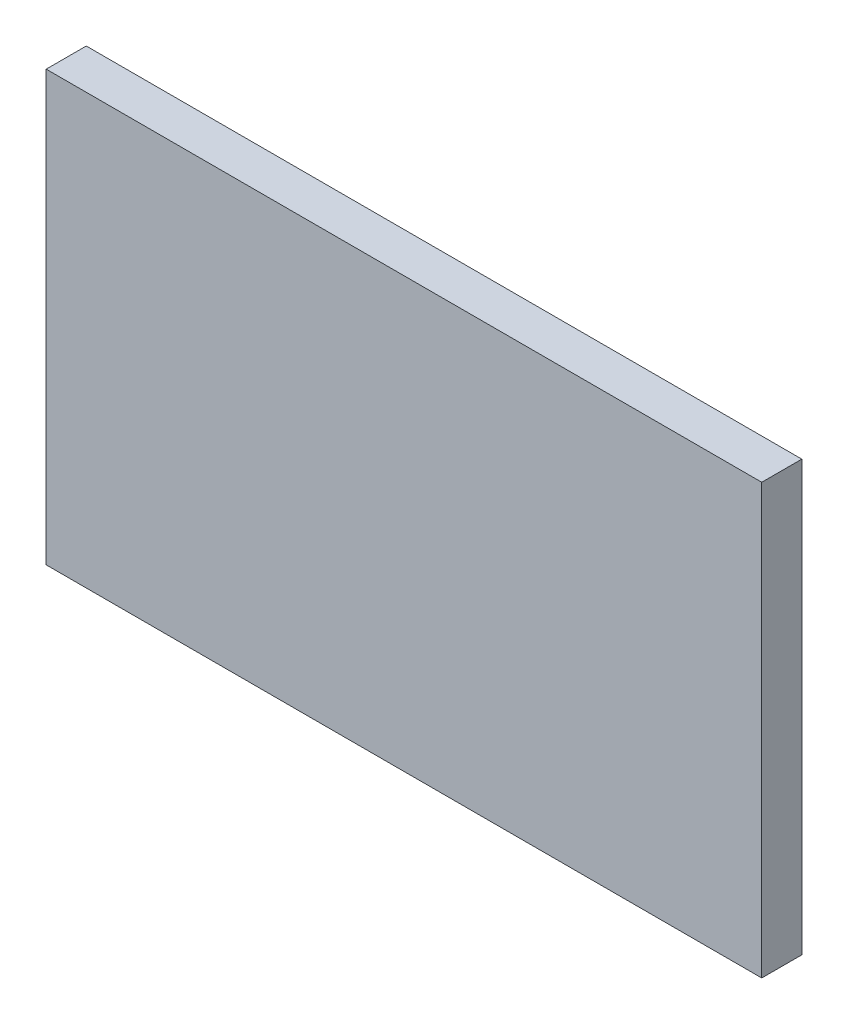
ISO-10303-21;
HEADER;
FILE_DESCRIPTION(('STEP AP214'),'2;1');
FILE_NAME('part.step','',(''),(''),'','','');
FILE_SCHEMA(('AUTOMOTIVE_DESIGN { 1 0 10303 214 1 1 1 1 }'));
ENDSEC;
DATA;
#1=APPLICATION_CONTEXT('core data for automotive mechanical design processes');
#2=APPLICATION_PROTOCOL_DEFINITION('international standard','automotive_design',2000,#1);
#3=PRODUCT_CONTEXT('',#1,'mechanical');
#4=PRODUCT('Part','Part','',(#3));
#5=PRODUCT_RELATED_PRODUCT_CATEGORY('part','',(#4));
#6=PRODUCT_DEFINITION_FORMATION('','',#4);
#7=PRODUCT_DEFINITION_CONTEXT('part definition',#1,'design');
#8=PRODUCT_DEFINITION('design','',#6,#7);
#9=PRODUCT_DEFINITION_SHAPE('','',#8);
#10=(LENGTH_UNIT() NAMED_UNIT(*) SI_UNIT(.MILLI.,.METRE.));
#11=(NAMED_UNIT(*) PLANE_ANGLE_UNIT() SI_UNIT($,.RADIAN.));
#12=(NAMED_UNIT(*) SI_UNIT($,.STERADIAN.) SOLID_ANGLE_UNIT());
#13=UNCERTAINTY_MEASURE_WITH_UNIT(LENGTH_MEASURE(1.E-05),#10,'distance_accuracy_value','');
#14=(GEOMETRIC_REPRESENTATION_CONTEXT(3) GLOBAL_UNCERTAINTY_ASSIGNED_CONTEXT((#13)) GLOBAL_UNIT_ASSIGNED_CONTEXT((#10,
#11,#12)) REPRESENTATION_CONTEXT('',''));
#15=CARTESIAN_POINT('',(0.,0.,0.));
#16=DIRECTION('',(0.,0.,1.));
#17=DIRECTION('',(1.,0.,0.));
#18=AXIS2_PLACEMENT_3D('',#15,#16,#17);
#19=CARTESIAN_POINT('',(-79.1957684576334,25.3826530612245,1.4));
#20=DIRECTION('',(1.,0.,0.));
#21=DIRECTION('',(0.,0.,-1.));
#22=AXIS2_PLACEMENT_3D('',#19,#20,#21);
#23=PLANE('',#22);
#24=DIRECTION('',(0.,-1.,0.));
#25=VECTOR('',#24,1.);
#26=CARTESIAN_POINT('',(-79.1957684576334,25.3826530612245,0.));
#27=LINE('',#26,#25);
#28=CARTESIAN_POINT('',(-79.1957684576334,25.3826530612245,0.));
#29=VERTEX_POINT('',#28);
#30=CARTESIAN_POINT('',(-79.1957684576334,10.3826530612245,0.));
#31=VERTEX_POINT('',#30);
#32=EDGE_CURVE('E96',#29,#31,#27,.T.);
#33=ORIENTED_EDGE('',*,*,#32,.T.);
#34=DIRECTION('',(0.,0.,-1.));
#35=VECTOR('',#34,1.);
#36=CARTESIAN_POINT('',(-79.1957684576334,10.3826530612245,1.4));
#37=LINE('',#36,#35);
#38=CARTESIAN_POINT('',(-79.1957684576334,10.3826530612245,1.4));
#39=VERTEX_POINT('',#38);
#40=EDGE_CURVE('E11',#39,#31,#37,.T.);
#41=ORIENTED_EDGE('',*,*,#40,.F.);
#42=DIRECTION('',(0.,-1.,0.));
#43=VECTOR('',#42,1.);
#44=CARTESIAN_POINT('',(-79.1957684576334,25.3826530612245,1.4));
#45=LINE('',#44,#43);
#46=CARTESIAN_POINT('',(-79.1957684576334,25.3826530612245,1.4));
#47=VERTEX_POINT('',#46);
#48=EDGE_CURVE('E84',#47,#39,#45,.T.);
#49=ORIENTED_EDGE('',*,*,#48,.F.);
#50=DIRECTION('',(0.,0.,-1.));
#51=VECTOR('',#50,1.);
#52=CARTESIAN_POINT('',(-79.1957684576334,25.3826530612245,1.4));
#53=LINE('',#52,#51);
#54=EDGE_CURVE('E92',#47,#29,#53,.T.);
#55=ORIENTED_EDGE('',*,*,#54,.T.);
#56=EDGE_LOOP('',(#33,#41,#49,#55));
#57=FACE_BOUND('',#56,.T.);
#58=ADVANCED_FACE('F33',(#57),#23,.F.);
#59=CARTESIAN_POINT('',(-79.1957684576334,10.3826530612245,1.4));
#60=DIRECTION('',(0.,1.,0.));
#61=DIRECTION('',(0.,0.,1.));
#62=AXIS2_PLACEMENT_3D('',#59,#60,#61);
#63=PLANE('',#62);
#64=DIRECTION('',(1.,0.,0.));
#65=VECTOR('',#64,1.);
#66=CARTESIAN_POINT('',(-79.1957684576334,10.3826530612245,0.));
#67=LINE('',#66,#65);
#68=CARTESIAN_POINT('',(-54.1957684576334,10.3826530612245,0.));
#69=VERTEX_POINT('',#68);
#70=EDGE_CURVE('E88',#31,#69,#67,.T.);
#71=ORIENTED_EDGE('',*,*,#70,.T.);
#72=DIRECTION('',(0.,0.,-1.));
#73=VECTOR('',#72,1.);
#74=CARTESIAN_POINT('',(-54.1957684576334,10.3826530612245,1.4));
#75=LINE('',#74,#73);
#76=CARTESIAN_POINT('',(-54.1957684576334,10.3826530612245,1.4));
#77=VERTEX_POINT('',#76);
#78=EDGE_CURVE('E41',#77,#69,#75,.T.);
#79=ORIENTED_EDGE('',*,*,#78,.F.);
#80=DIRECTION('',(1.,0.,0.));
#81=VECTOR('',#80,1.);
#82=CARTESIAN_POINT('',(-79.1957684576334,10.3826530612245,1.4));
#83=LINE('',#82,#81);
#84=EDGE_CURVE('E79',#39,#77,#83,.T.);
#85=ORIENTED_EDGE('',*,*,#84,.F.);
#86=ORIENTED_EDGE('',*,*,#40,.T.);
#87=EDGE_LOOP('',(#71,#79,#85,#86));
#88=FACE_BOUND('',#87,.T.);
#89=ADVANCED_FACE('F87',(#88),#63,.F.);
#90=CARTESIAN_POINT('',(-54.1957684576334,25.3826530612245,1.4));
#91=DIRECTION('',(-1.,0.,0.));
#92=DIRECTION('',(0.,-1.,0.));
#93=AXIS2_PLACEMENT_3D('',#90,#91,#92);
#94=PLANE('',#93);
#95=DIRECTION('',(0.,1.,0.));
#96=VECTOR('',#95,1.);
#97=CARTESIAN_POINT('',(-54.1957684576334,25.3826530612245,0.));
#98=LINE('',#97,#96);
#99=CARTESIAN_POINT('',(-54.1957684576334,25.3826530612245,0.));
#100=VERTEX_POINT('',#99);
#101=EDGE_CURVE('E66',#69,#100,#98,.T.);
#102=ORIENTED_EDGE('',*,*,#101,.T.);
#103=DIRECTION('',(0.,0.,-1.));
#104=VECTOR('',#103,1.);
#105=CARTESIAN_POINT('',(-54.1957684576334,25.3826530612245,1.4));
#106=LINE('',#105,#104);
#107=CARTESIAN_POINT('',(-54.1957684576334,25.3826530612245,1.4));
#108=VERTEX_POINT('',#107);
#109=EDGE_CURVE('E89',#108,#100,#106,.T.);
#110=ORIENTED_EDGE('',*,*,#109,.F.);
#111=DIRECTION('',(0.,1.,0.));
#112=VECTOR('',#111,1.);
#113=CARTESIAN_POINT('',(-54.1957684576334,25.3826530612245,1.4));
#114=LINE('',#113,#112);
#115=EDGE_CURVE('E82',#77,#108,#114,.T.);
#116=ORIENTED_EDGE('',*,*,#115,.F.);
#117=ORIENTED_EDGE('',*,*,#78,.T.);
#118=EDGE_LOOP('',(#102,#110,#116,#117));
#119=FACE_BOUND('',#118,.T.);
#120=ADVANCED_FACE('F90',(#119),#94,.F.);
#121=CARTESIAN_POINT('',(-79.1957684576334,25.3826530612245,1.4));
#122=DIRECTION('',(0.,-1.,0.));
#123=DIRECTION('',(0.,0.,-1.));
#124=AXIS2_PLACEMENT_3D('',#121,#122,#123);
#125=PLANE('',#124);
#126=DIRECTION('',(-1.,0.,0.));
#127=VECTOR('',#126,1.);
#128=CARTESIAN_POINT('',(-79.1957684576334,25.3826530612245,0.));
#129=LINE('',#128,#127);
#130=EDGE_CURVE('E72',#100,#29,#129,.T.);
#131=ORIENTED_EDGE('',*,*,#130,.T.);
#132=ORIENTED_EDGE('',*,*,#54,.F.);
#133=DIRECTION('',(-1.,0.,0.));
#134=VECTOR('',#133,1.);
#135=CARTESIAN_POINT('',(-79.1957684576334,25.3826530612245,1.4));
#136=LINE('',#135,#134);
#137=EDGE_CURVE('E49',#108,#47,#136,.T.);
#138=ORIENTED_EDGE('',*,*,#137,.F.);
#139=ORIENTED_EDGE('',*,*,#109,.T.);
#140=EDGE_LOOP('',(#131,#132,#138,#139));
#141=FACE_BOUND('',#140,.T.);
#142=ADVANCED_FACE('F103',(#141),#125,.F.);
#143=CARTESIAN_POINT('',(0.,0.,1.4));
#144=DIRECTION('',(0.,0.,1.));
#145=DIRECTION('',(1.,0.,0.));
#146=AXIS2_PLACEMENT_3D('',#143,#144,#145);
#147=PLANE('',#146);
#148=ORIENTED_EDGE('',*,*,#48,.T.);
#149=ORIENTED_EDGE('',*,*,#84,.T.);
#150=ORIENTED_EDGE('',*,*,#115,.T.);
#151=ORIENTED_EDGE('',*,*,#137,.T.);
#152=EDGE_LOOP('',(#148,#149,#150,#151));
#153=FACE_BOUND('',#152,.T.);
#154=ADVANCED_FACE('F80',(#153),#147,.T.);
#155=CARTESIAN_POINT('',(0.,0.,0.));
#156=DIRECTION('',(0.,0.,1.));
#157=DIRECTION('',(1.,0.,0.));
#158=AXIS2_PLACEMENT_3D('',#155,#156,#157);
#159=PLANE('',#158);
#160=ORIENTED_EDGE('',*,*,#32,.F.);
#161=ORIENTED_EDGE('',*,*,#130,.F.);
#162=ORIENTED_EDGE('',*,*,#101,.F.);
#163=ORIENTED_EDGE('',*,*,#70,.F.);
#164=EDGE_LOOP('',(#160,#161,#162,#163));
#165=FACE_BOUND('',#164,.T.);
#166=ADVANCED_FACE('F106',(#165),#159,.F.);
#167=CLOSED_SHELL('',(#58,#89,#120,#142,#154,#166));
#168=MANIFOLD_SOLID_BREP('B2',#167);
#169=ADVANCED_BREP_SHAPE_REPRESENTATION('',(#18,#168),#14);
#170=SHAPE_DEFINITION_REPRESENTATION(#9,#169);
ENDSEC;
END-ISO-10303-21;
